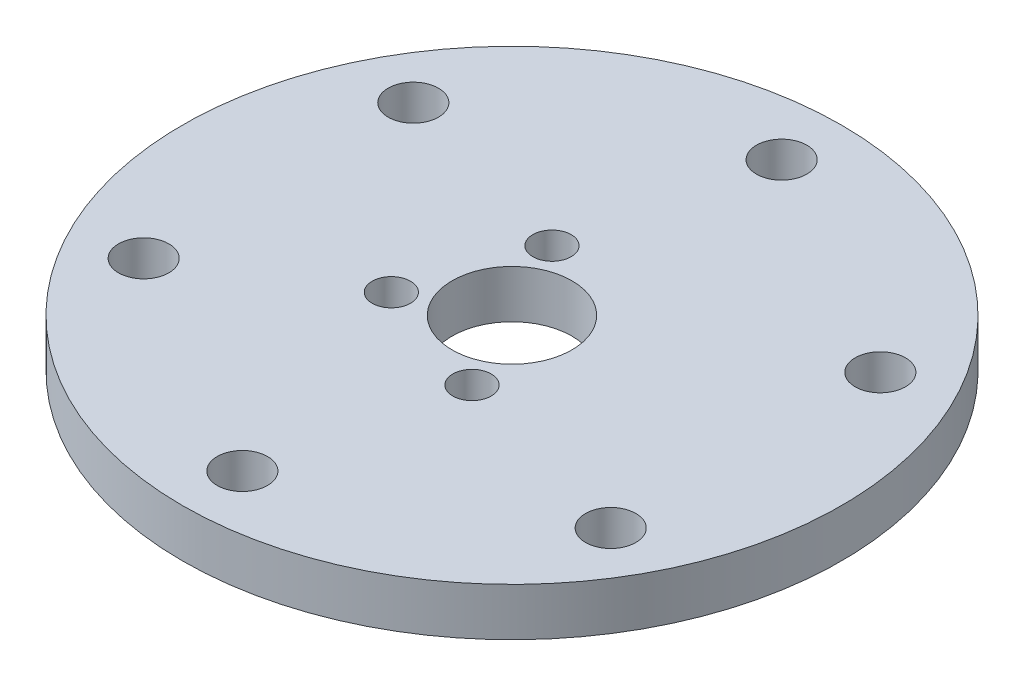
ISO-10303-21;
HEADER;
FILE_DESCRIPTION(('STEP AP214'),'2;1');
FILE_NAME('part.step','',(''),(''),'','','');
FILE_SCHEMA(('AUTOMOTIVE_DESIGN { 1 0 10303 214 1 1 1 1 }'));
ENDSEC;
DATA;
#1=APPLICATION_CONTEXT('core data for automotive mechanical design processes');
#2=APPLICATION_PROTOCOL_DEFINITION('international standard','automotive_design',2000,#1);
#3=PRODUCT_CONTEXT('',#1,'mechanical');
#4=PRODUCT('Part','Part','',(#3));
#5=PRODUCT_RELATED_PRODUCT_CATEGORY('part','',(#4));
#6=PRODUCT_DEFINITION_FORMATION('','',#4);
#7=PRODUCT_DEFINITION_CONTEXT('part definition',#1,'design');
#8=PRODUCT_DEFINITION('design','',#6,#7);
#9=PRODUCT_DEFINITION_SHAPE('','',#8);
#10=(LENGTH_UNIT() NAMED_UNIT(*) SI_UNIT(.MILLI.,.METRE.));
#11=(NAMED_UNIT(*) PLANE_ANGLE_UNIT() SI_UNIT($,.RADIAN.));
#12=(NAMED_UNIT(*) SI_UNIT($,.STERADIAN.) SOLID_ANGLE_UNIT());
#13=UNCERTAINTY_MEASURE_WITH_UNIT(LENGTH_MEASURE(1.E-05),#10,'distance_accuracy_value','');
#14=(GEOMETRIC_REPRESENTATION_CONTEXT(3) GLOBAL_UNCERTAINTY_ASSIGNED_CONTEXT((#13)) GLOBAL_UNIT_ASSIGNED_CONTEXT((#10,
#11,#12)) REPRESENTATION_CONTEXT('',''));
#15=CARTESIAN_POINT('',(0.,0.,0.));
#16=DIRECTION('',(0.,0.,1.));
#17=DIRECTION('',(1.,0.,0.));
#18=AXIS2_PLACEMENT_3D('',#15,#16,#17);
#19=CARTESIAN_POINT('',(0.,4.,0.));
#20=DIRECTION('',(0.,1.,0.));
#21=DIRECTION('',(0.,0.,-1.));
#22=AXIS2_PLACEMENT_3D('',#19,#20,#21);
#23=PLANE('',#22);
#24=CARTESIAN_POINT('',(3.36569174841225,4.,6.70239651577476));
#25=DIRECTION('',(0.,1.,0.));
#26=DIRECTION('',(0.,0.,1.));
#27=AXIS2_PLACEMENT_3D('',#24,#25,#26);
#28=CIRCLE('',#27,1.6);
#29=CARTESIAN_POINT('',(3.36569174841225,4.,8.30239651577476));
#30=VERTEX_POINT('',#29);
#31=EDGE_CURVE('E93',#30,#30,#28,.T.);
#32=ORIENTED_EDGE('',*,*,#31,.F.);
#33=EDGE_LOOP('',(#32));
#34=FACE_BOUND('',#33,.T.);
#35=CARTESIAN_POINT('',(-6.70239651577476,4.,3.36569174841225));
#36=DIRECTION('',(0.,1.,0.));
#37=DIRECTION('',(0.,0.,1.));
#38=AXIS2_PLACEMENT_3D('',#35,#36,#37);
#39=CIRCLE('',#38,1.6);
#40=CARTESIAN_POINT('',(-6.70239651577476,4.,4.96569174841225));
#41=VERTEX_POINT('',#40);
#42=EDGE_CURVE('E102',#41,#41,#39,.T.);
#43=ORIENTED_EDGE('',*,*,#42,.F.);
#44=EDGE_LOOP('',(#43));
#45=FACE_BOUND('',#44,.T.);
#46=CARTESIAN_POINT('',(-3.36569174841225,4.,-6.70239651577476));
#47=DIRECTION('',(0.,1.,0.));
#48=DIRECTION('',(0.,0.,1.));
#49=AXIS2_PLACEMENT_3D('',#46,#47,#48);
#50=CIRCLE('',#49,1.6);
#51=CARTESIAN_POINT('',(-3.36569174841225,4.,-5.10239651577476));
#52=VERTEX_POINT('',#51);
#53=EDGE_CURVE('E96',#52,#52,#50,.T.);
#54=ORIENTED_EDGE('',*,*,#53,.F.);
#55=EDGE_LOOP('',(#54));
#56=FACE_BOUND('',#55,.T.);
#57=CARTESIAN_POINT('',(-19.4855715851499,4.,-11.25));
#58=DIRECTION('',(0.,-1.,0.));
#59=DIRECTION('',(0.,0.,-1.));
#60=AXIS2_PLACEMENT_3D('',#57,#58,#59);
#61=CIRCLE('',#60,2.1);
#62=CARTESIAN_POINT('',(-19.4855715851499,4.,-13.35));
#63=VERTEX_POINT('',#62);
#64=EDGE_CURVE('E81',#63,#63,#61,.T.);
#65=ORIENTED_EDGE('',*,*,#64,.T.);
#66=EDGE_LOOP('',(#65));
#67=FACE_BOUND('',#66,.T.);
#68=CARTESIAN_POINT('',(19.4855715851499,4.,-11.25));
#69=DIRECTION('',(0.,-1.,0.));
#70=DIRECTION('',(0.,0.,-1.));
#71=AXIS2_PLACEMENT_3D('',#68,#69,#70);
#72=CIRCLE('',#71,2.1);
#73=CARTESIAN_POINT('',(19.4855715851499,4.,-13.35));
#74=VERTEX_POINT('',#73);
#75=EDGE_CURVE('E69',#74,#74,#72,.T.);
#76=ORIENTED_EDGE('',*,*,#75,.T.);
#77=EDGE_LOOP('',(#76));
#78=FACE_BOUND('',#77,.T.);
#79=CARTESIAN_POINT('',(0.,4.,0.));
#80=DIRECTION('',(0.,-1.,0.));
#81=DIRECTION('',(0.,0.,-1.));
#82=AXIS2_PLACEMENT_3D('',#79,#80,#81);
#83=CIRCLE('',#82,5.);
#84=CARTESIAN_POINT('',(0.,4.,-5.));
#85=VERTEX_POINT('',#84);
#86=EDGE_CURVE('E57',#85,#85,#83,.T.);
#87=ORIENTED_EDGE('',*,*,#86,.T.);
#88=EDGE_LOOP('',(#87));
#89=FACE_BOUND('',#88,.T.);
#90=CARTESIAN_POINT('',(0.,4.,0.));
#91=DIRECTION('',(0.,-1.,0.));
#92=DIRECTION('',(0.,0.,-1.));
#93=AXIS2_PLACEMENT_3D('',#90,#91,#92);
#94=CIRCLE('',#93,27.5);
#95=CARTESIAN_POINT('',(0.,4.,-27.5));
#96=VERTEX_POINT('',#95);
#97=EDGE_CURVE('E10',#96,#96,#94,.T.);
#98=ORIENTED_EDGE('',*,*,#97,.F.);
#99=EDGE_LOOP('',(#98));
#100=FACE_BOUND('',#99,.T.);
#101=CARTESIAN_POINT('',(0.,4.,22.5));
#102=DIRECTION('',(0.,-1.,0.));
#103=DIRECTION('',(0.,0.,-1.));
#104=AXIS2_PLACEMENT_3D('',#101,#102,#103);
#105=CIRCLE('',#104,2.1);
#106=CARTESIAN_POINT('',(0.,4.,20.4));
#107=VERTEX_POINT('',#106);
#108=EDGE_CURVE('E52',#107,#107,#105,.T.);
#109=ORIENTED_EDGE('',*,*,#108,.T.);
#110=EDGE_LOOP('',(#109));
#111=FACE_BOUND('',#110,.T.);
#112=CARTESIAN_POINT('',(19.4855715851499,4.,11.25));
#113=DIRECTION('',(0.,-1.,0.));
#114=DIRECTION('',(0.,0.,-1.));
#115=AXIS2_PLACEMENT_3D('',#112,#113,#114);
#116=CIRCLE('',#115,2.1);
#117=CARTESIAN_POINT('',(19.4855715851499,4.,9.15));
#118=VERTEX_POINT('',#117);
#119=EDGE_CURVE('E63',#118,#118,#116,.T.);
#120=ORIENTED_EDGE('',*,*,#119,.T.);
#121=EDGE_LOOP('',(#120));
#122=FACE_BOUND('',#121,.T.);
#123=CARTESIAN_POINT('',(0.,4.,-22.5));
#124=DIRECTION('',(0.,-1.,0.));
#125=DIRECTION('',(0.,0.,-1.));
#126=AXIS2_PLACEMENT_3D('',#123,#124,#125);
#127=CIRCLE('',#126,2.1);
#128=CARTESIAN_POINT('',(0.,4.,-24.6));
#129=VERTEX_POINT('',#128);
#130=EDGE_CURVE('E75',#129,#129,#127,.T.);
#131=ORIENTED_EDGE('',*,*,#130,.T.);
#132=EDGE_LOOP('',(#131));
#133=FACE_BOUND('',#132,.T.);
#134=CARTESIAN_POINT('',(-19.4855715851499,4.,11.25));
#135=DIRECTION('',(0.,-1.,0.));
#136=DIRECTION('',(0.,0.,-1.));
#137=AXIS2_PLACEMENT_3D('',#134,#135,#136);
#138=CIRCLE('',#137,2.1);
#139=CARTESIAN_POINT('',(-19.4855715851499,4.,9.15));
#140=VERTEX_POINT('',#139);
#141=EDGE_CURVE('E87',#140,#140,#138,.T.);
#142=ORIENTED_EDGE('',*,*,#141,.T.);
#143=EDGE_LOOP('',(#142));
#144=FACE_BOUND('',#143,.T.);
#145=ADVANCED_FACE('F41',(#34,#45,#56,#67,#78,#89,#100,#111,#122,#133,#144),#23,.T.);
#146=CARTESIAN_POINT('',(0.,0.,0.));
#147=DIRECTION('',(0.,1.,0.));
#148=DIRECTION('',(0.,0.,-1.));
#149=AXIS2_PLACEMENT_3D('',#146,#147,#148);
#150=PLANE('',#149);
#151=CARTESIAN_POINT('',(3.36569174841225,0.,6.70239651577476));
#152=DIRECTION('',(0.,1.,0.));
#153=DIRECTION('',(0.,0.,1.));
#154=AXIS2_PLACEMENT_3D('',#151,#152,#153);
#155=CIRCLE('',#154,1.6);
#156=CARTESIAN_POINT('',(3.36569174841225,0.,8.30239651577476));
#157=VERTEX_POINT('',#156);
#158=EDGE_CURVE('E108',#157,#157,#155,.T.);
#159=ORIENTED_EDGE('',*,*,#158,.T.);
#160=EDGE_LOOP('',(#159));
#161=FACE_BOUND('',#160,.T.);
#162=CARTESIAN_POINT('',(-6.70239651577476,0.,3.36569174841225));
#163=DIRECTION('',(0.,1.,0.));
#164=DIRECTION('',(0.,0.,1.));
#165=AXIS2_PLACEMENT_3D('',#162,#163,#164);
#166=CIRCLE('',#165,1.6);
#167=CARTESIAN_POINT('',(-6.70239651577476,0.,4.96569174841225));
#168=VERTEX_POINT('',#167);
#169=EDGE_CURVE('E105',#168,#168,#166,.T.);
#170=ORIENTED_EDGE('',*,*,#169,.T.);
#171=EDGE_LOOP('',(#170));
#172=FACE_BOUND('',#171,.T.);
#173=CARTESIAN_POINT('',(-3.36569174841225,0.,-6.70239651577476));
#174=DIRECTION('',(0.,1.,0.));
#175=DIRECTION('',(0.,0.,1.));
#176=AXIS2_PLACEMENT_3D('',#173,#174,#175);
#177=CIRCLE('',#176,1.6);
#178=CARTESIAN_POINT('',(-3.36569174841225,0.,-5.10239651577476));
#179=VERTEX_POINT('',#178);
#180=EDGE_CURVE('E99',#179,#179,#177,.T.);
#181=ORIENTED_EDGE('',*,*,#180,.T.);
#182=EDGE_LOOP('',(#181));
#183=FACE_BOUND('',#182,.T.);
#184=CARTESIAN_POINT('',(0.,0.,0.));
#185=DIRECTION('',(0.,-1.,0.));
#186=DIRECTION('',(0.,0.,-1.));
#187=AXIS2_PLACEMENT_3D('',#184,#185,#186);
#188=CIRCLE('',#187,27.5);
#189=CARTESIAN_POINT('',(0.,0.,-27.5));
#190=VERTEX_POINT('',#189);
#191=EDGE_CURVE('E45',#190,#190,#188,.T.);
#192=ORIENTED_EDGE('',*,*,#191,.T.);
#193=EDGE_LOOP('',(#192));
#194=FACE_BOUND('',#193,.T.);
#195=CARTESIAN_POINT('',(0.,0.,22.5));
#196=DIRECTION('',(0.,-1.,0.));
#197=DIRECTION('',(0.,0.,-1.));
#198=AXIS2_PLACEMENT_3D('',#195,#196,#197);
#199=CIRCLE('',#198,2.1);
#200=CARTESIAN_POINT('',(0.,0.,20.4));
#201=VERTEX_POINT('',#200);
#202=EDGE_CURVE('E54',#201,#201,#199,.T.);
#203=ORIENTED_EDGE('',*,*,#202,.F.);
#204=EDGE_LOOP('',(#203));
#205=FACE_BOUND('',#204,.T.);
#206=CARTESIAN_POINT('',(0.,0.,0.));
#207=DIRECTION('',(0.,-1.,0.));
#208=DIRECTION('',(0.,0.,-1.));
#209=AXIS2_PLACEMENT_3D('',#206,#207,#208);
#210=CIRCLE('',#209,5.);
#211=CARTESIAN_POINT('',(0.,0.,-5.));
#212=VERTEX_POINT('',#211);
#213=EDGE_CURVE('E60',#212,#212,#210,.T.);
#214=ORIENTED_EDGE('',*,*,#213,.F.);
#215=EDGE_LOOP('',(#214));
#216=FACE_BOUND('',#215,.T.);
#217=CARTESIAN_POINT('',(19.4855715851499,0.,11.25));
#218=DIRECTION('',(0.,-1.,0.));
#219=DIRECTION('',(0.,0.,-1.));
#220=AXIS2_PLACEMENT_3D('',#217,#218,#219);
#221=CIRCLE('',#220,2.1);
#222=CARTESIAN_POINT('',(19.4855715851499,0.,9.15));
#223=VERTEX_POINT('',#222);
#224=EDGE_CURVE('E66',#223,#223,#221,.T.);
#225=ORIENTED_EDGE('',*,*,#224,.F.);
#226=EDGE_LOOP('',(#225));
#227=FACE_BOUND('',#226,.T.);
#228=CARTESIAN_POINT('',(19.4855715851499,0.,-11.25));
#229=DIRECTION('',(0.,-1.,0.));
#230=DIRECTION('',(0.,0.,-1.));
#231=AXIS2_PLACEMENT_3D('',#228,#229,#230);
#232=CIRCLE('',#231,2.1);
#233=CARTESIAN_POINT('',(19.4855715851499,0.,-13.35));
#234=VERTEX_POINT('',#233);
#235=EDGE_CURVE('E72',#234,#234,#232,.T.);
#236=ORIENTED_EDGE('',*,*,#235,.F.);
#237=EDGE_LOOP('',(#236));
#238=FACE_BOUND('',#237,.T.);
#239=CARTESIAN_POINT('',(0.,0.,-22.5));
#240=DIRECTION('',(0.,-1.,0.));
#241=DIRECTION('',(0.,0.,-1.));
#242=AXIS2_PLACEMENT_3D('',#239,#240,#241);
#243=CIRCLE('',#242,2.1);
#244=CARTESIAN_POINT('',(0.,0.,-24.6));
#245=VERTEX_POINT('',#244);
#246=EDGE_CURVE('E78',#245,#245,#243,.T.);
#247=ORIENTED_EDGE('',*,*,#246,.F.);
#248=EDGE_LOOP('',(#247));
#249=FACE_BOUND('',#248,.T.);
#250=CARTESIAN_POINT('',(-19.4855715851499,0.,-11.25));
#251=DIRECTION('',(0.,-1.,0.));
#252=DIRECTION('',(0.,0.,-1.));
#253=AXIS2_PLACEMENT_3D('',#250,#251,#252);
#254=CIRCLE('',#253,2.1);
#255=CARTESIAN_POINT('',(-19.4855715851499,0.,-13.35));
#256=VERTEX_POINT('',#255);
#257=EDGE_CURVE('E84',#256,#256,#254,.T.);
#258=ORIENTED_EDGE('',*,*,#257,.F.);
#259=EDGE_LOOP('',(#258));
#260=FACE_BOUND('',#259,.T.);
#261=CARTESIAN_POINT('',(-19.4855715851499,0.,11.25));
#262=DIRECTION('',(0.,-1.,0.));
#263=DIRECTION('',(0.,0.,-1.));
#264=AXIS2_PLACEMENT_3D('',#261,#262,#263);
#265=CIRCLE('',#264,2.1);
#266=CARTESIAN_POINT('',(-19.4855715851499,0.,9.15));
#267=VERTEX_POINT('',#266);
#268=EDGE_CURVE('E90',#267,#267,#265,.T.);
#269=ORIENTED_EDGE('',*,*,#268,.F.);
#270=EDGE_LOOP('',(#269));
#271=FACE_BOUND('',#270,.T.);
#272=ADVANCED_FACE('F119',(#161,#172,#183,#194,#205,#216,#227,#238,#249,#260,#271),#150,.F.);
#273=CARTESIAN_POINT('',(0.,4.,0.));
#274=DIRECTION('',(0.,-1.,0.));
#275=DIRECTION('',(0.,0.,1.));
#276=AXIS2_PLACEMENT_3D('',#273,#274,#275);
#277=CYLINDRICAL_SURFACE('',#276,27.5);
#278=ORIENTED_EDGE('',*,*,#97,.T.);
#279=EDGE_LOOP('',(#278));
#280=FACE_BOUND('',#279,.T.);
#281=ORIENTED_EDGE('',*,*,#191,.F.);
#282=EDGE_LOOP('',(#281));
#283=FACE_BOUND('',#282,.T.);
#284=ADVANCED_FACE('F43',(#280,#283),#277,.T.);
#285=CARTESIAN_POINT('',(0.,4.,22.5));
#286=DIRECTION('',(0.,-1.,0.));
#287=DIRECTION('',(0.,0.,1.));
#288=AXIS2_PLACEMENT_3D('',#285,#286,#287);
#289=CYLINDRICAL_SURFACE('',#288,2.1);
#290=ORIENTED_EDGE('',*,*,#108,.F.);
#291=EDGE_LOOP('',(#290));
#292=FACE_BOUND('',#291,.T.);
#293=ORIENTED_EDGE('',*,*,#202,.T.);
#294=EDGE_LOOP('',(#293));
#295=FACE_BOUND('',#294,.T.);
#296=ADVANCED_FACE('F153',(#292,#295),#289,.F.);
#297=CARTESIAN_POINT('',(0.,4.,0.));
#298=DIRECTION('',(0.,-1.,0.));
#299=DIRECTION('',(0.,0.,1.));
#300=AXIS2_PLACEMENT_3D('',#297,#298,#299);
#301=CYLINDRICAL_SURFACE('',#300,5.);
#302=ORIENTED_EDGE('',*,*,#86,.F.);
#303=EDGE_LOOP('',(#302));
#304=FACE_BOUND('',#303,.T.);
#305=ORIENTED_EDGE('',*,*,#213,.T.);
#306=EDGE_LOOP('',(#305));
#307=FACE_BOUND('',#306,.T.);
#308=ADVANCED_FACE('F158',(#304,#307),#301,.F.);
#309=CARTESIAN_POINT('',(19.4855715851499,4.,11.25));
#310=DIRECTION('',(0.,-1.,0.));
#311=DIRECTION('',(0.,0.,1.));
#312=AXIS2_PLACEMENT_3D('',#309,#310,#311);
#313=CYLINDRICAL_SURFACE('',#312,2.1);
#314=ORIENTED_EDGE('',*,*,#119,.F.);
#315=EDGE_LOOP('',(#314));
#316=FACE_BOUND('',#315,.T.);
#317=ORIENTED_EDGE('',*,*,#224,.T.);
#318=EDGE_LOOP('',(#317));
#319=FACE_BOUND('',#318,.T.);
#320=ADVANCED_FACE('F162',(#316,#319),#313,.F.);
#321=CARTESIAN_POINT('',(19.4855715851499,4.,-11.25));
#322=DIRECTION('',(0.,-1.,0.));
#323=DIRECTION('',(0.,0.,1.));
#324=AXIS2_PLACEMENT_3D('',#321,#322,#323);
#325=CYLINDRICAL_SURFACE('',#324,2.1);
#326=ORIENTED_EDGE('',*,*,#75,.F.);
#327=EDGE_LOOP('',(#326));
#328=FACE_BOUND('',#327,.T.);
#329=ORIENTED_EDGE('',*,*,#235,.T.);
#330=EDGE_LOOP('',(#329));
#331=FACE_BOUND('',#330,.T.);
#332=ADVANCED_FACE('F166',(#328,#331),#325,.F.);
#333=CARTESIAN_POINT('',(0.,4.,-22.5));
#334=DIRECTION('',(0.,-1.,0.));
#335=DIRECTION('',(0.,0.,1.));
#336=AXIS2_PLACEMENT_3D('',#333,#334,#335);
#337=CYLINDRICAL_SURFACE('',#336,2.1);
#338=ORIENTED_EDGE('',*,*,#130,.F.);
#339=EDGE_LOOP('',(#338));
#340=FACE_BOUND('',#339,.T.);
#341=ORIENTED_EDGE('',*,*,#246,.T.);
#342=EDGE_LOOP('',(#341));
#343=FACE_BOUND('',#342,.T.);
#344=ADVANCED_FACE('F170',(#340,#343),#337,.F.);
#345=CARTESIAN_POINT('',(-19.4855715851499,4.,-11.25));
#346=DIRECTION('',(0.,-1.,0.));
#347=DIRECTION('',(0.,0.,1.));
#348=AXIS2_PLACEMENT_3D('',#345,#346,#347);
#349=CYLINDRICAL_SURFACE('',#348,2.1);
#350=ORIENTED_EDGE('',*,*,#64,.F.);
#351=EDGE_LOOP('',(#350));
#352=FACE_BOUND('',#351,.T.);
#353=ORIENTED_EDGE('',*,*,#257,.T.);
#354=EDGE_LOOP('',(#353));
#355=FACE_BOUND('',#354,.T.);
#356=ADVANCED_FACE('F144',(#352,#355),#349,.F.);
#357=CARTESIAN_POINT('',(-19.4855715851499,4.,11.25));
#358=DIRECTION('',(0.,-1.,0.));
#359=DIRECTION('',(0.,0.,1.));
#360=AXIS2_PLACEMENT_3D('',#357,#358,#359);
#361=CYLINDRICAL_SURFACE('',#360,2.1);
#362=ORIENTED_EDGE('',*,*,#141,.F.);
#363=EDGE_LOOP('',(#362));
#364=FACE_BOUND('',#363,.T.);
#365=ORIENTED_EDGE('',*,*,#268,.T.);
#366=EDGE_LOOP('',(#365));
#367=FACE_BOUND('',#366,.T.);
#368=ADVANCED_FACE('F140',(#364,#367),#361,.F.);
#369=CARTESIAN_POINT('',(-3.36569174841225,4.,-6.70239651577476));
#370=DIRECTION('',(0.,-1.,0.));
#371=DIRECTION('',(0.,0.,1.));
#372=AXIS2_PLACEMENT_3D('',#369,#370,#371);
#373=CYLINDRICAL_SURFACE('',#372,1.6);
#374=ORIENTED_EDGE('',*,*,#53,.T.);
#375=EDGE_LOOP('',(#374));
#376=FACE_BOUND('',#375,.T.);
#377=ORIENTED_EDGE('',*,*,#180,.F.);
#378=EDGE_LOOP('',(#377));
#379=FACE_BOUND('',#378,.T.);
#380=ADVANCED_FACE('F143',(#376,#379),#373,.F.);
#381=CARTESIAN_POINT('',(-6.70239651577476,4.,3.36569174841225));
#382=DIRECTION('',(0.,-1.,0.));
#383=DIRECTION('',(0.,0.,1.));
#384=AXIS2_PLACEMENT_3D('',#381,#382,#383);
#385=CYLINDRICAL_SURFACE('',#384,1.6);
#386=ORIENTED_EDGE('',*,*,#42,.T.);
#387=EDGE_LOOP('',(#386));
#388=FACE_BOUND('',#387,.T.);
#389=ORIENTED_EDGE('',*,*,#169,.F.);
#390=EDGE_LOOP('',(#389));
#391=FACE_BOUND('',#390,.T.);
#392=ADVANCED_FACE('F180',(#388,#391),#385,.F.);
#393=CARTESIAN_POINT('',(3.36569174841225,4.,6.70239651577476));
#394=DIRECTION('',(0.,-1.,0.));
#395=DIRECTION('',(0.,0.,1.));
#396=AXIS2_PLACEMENT_3D('',#393,#394,#395);
#397=CYLINDRICAL_SURFACE('',#396,1.6);
#398=ORIENTED_EDGE('',*,*,#31,.T.);
#399=EDGE_LOOP('',(#398));
#400=FACE_BOUND('',#399,.T.);
#401=ORIENTED_EDGE('',*,*,#158,.F.);
#402=EDGE_LOOP('',(#401));
#403=FACE_BOUND('',#402,.T.);
#404=ADVANCED_FACE('F114',(#400,#403),#397,.F.);
#405=CLOSED_SHELL('',(#145,#272,#284,#296,#308,#320,#332,#344,#356,#368,#380,#392,#404));
#406=MANIFOLD_SOLID_BREP('B2',#405);
#407=ADVANCED_BREP_SHAPE_REPRESENTATION('',(#18,#406),#14);
#408=SHAPE_DEFINITION_REPRESENTATION(#9,#407);
ENDSEC;
END-ISO-10303-21;
